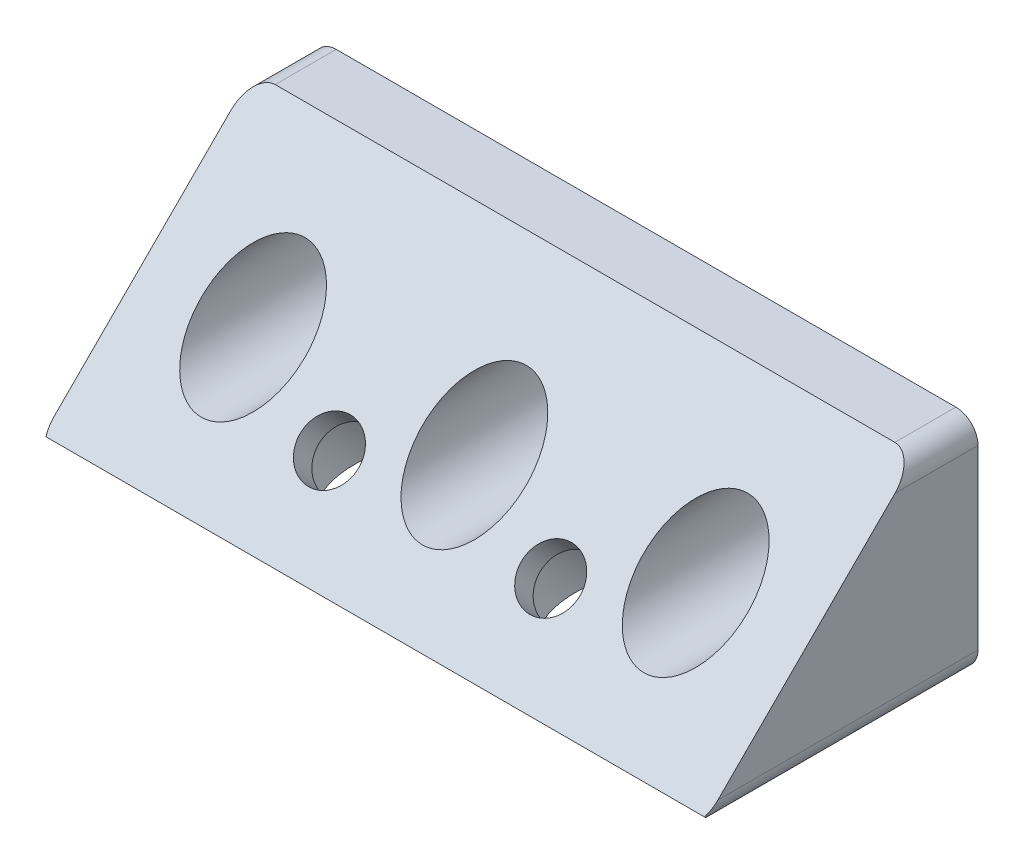
ISO-10303-21;
HEADER;
FILE_DESCRIPTION(('STEP AP214'),'2;1');
FILE_NAME('part.step','',(''),(''),'','','');
FILE_SCHEMA(('AUTOMOTIVE_DESIGN { 1 0 10303 214 1 1 1 1 }'));
ENDSEC;
DATA;
#1=APPLICATION_CONTEXT('core data for automotive mechanical design processes');
#2=APPLICATION_PROTOCOL_DEFINITION('international standard','automotive_design',2000,#1);
#3=PRODUCT_CONTEXT('',#1,'mechanical');
#4=PRODUCT('Part','Part','',(#3));
#5=PRODUCT_RELATED_PRODUCT_CATEGORY('part','',(#4));
#6=PRODUCT_DEFINITION_FORMATION('','',#4);
#7=PRODUCT_DEFINITION_CONTEXT('part definition',#1,'design');
#8=PRODUCT_DEFINITION('design','',#6,#7);
#9=PRODUCT_DEFINITION_SHAPE('','',#8);
#10=(LENGTH_UNIT() NAMED_UNIT(*) SI_UNIT(.MILLI.,.METRE.));
#11=(NAMED_UNIT(*) PLANE_ANGLE_UNIT() SI_UNIT($,.RADIAN.));
#12=(NAMED_UNIT(*) SI_UNIT($,.STERADIAN.) SOLID_ANGLE_UNIT());
#13=UNCERTAINTY_MEASURE_WITH_UNIT(LENGTH_MEASURE(1.E-05),#10,'distance_accuracy_value','');
#14=(GEOMETRIC_REPRESENTATION_CONTEXT(3) GLOBAL_UNCERTAINTY_ASSIGNED_CONTEXT((#13)) GLOBAL_UNIT_ASSIGNED_CONTEXT((#10,
#11,#12)) REPRESENTATION_CONTEXT('',''));
#15=CARTESIAN_POINT('',(0.,0.,0.));
#16=DIRECTION('',(0.,0.,1.));
#17=DIRECTION('',(1.,0.,0.));
#18=AXIS2_PLACEMENT_3D('',#15,#16,#17);
#19=CARTESIAN_POINT('',(0.,25.4,31.75));
#20=DIRECTION('',(0.,-1.,0.));
#21=DIRECTION('',(0.,0.,-1.));
#22=AXIS2_PLACEMENT_3D('',#19,#20,#21);
#23=PLANE('',#22);
#24=DIRECTION('',(-1.,0.,0.));
#25=VECTOR('',#24,1.);
#26=CARTESIAN_POINT('',(0.,25.4,0.));
#27=LINE('',#26,#25);
#28=CARTESIAN_POINT('',(73.66,25.4,0.));
#29=VERTEX_POINT('',#28);
#30=CARTESIAN_POINT('',(2.54,25.4,0.));
#31=VERTEX_POINT('',#30);
#32=EDGE_CURVE('E131',#29,#31,#27,.T.);
#33=ORIENTED_EDGE('',*,*,#32,.T.);
#34=DIRECTION('',(0.,0.,-1.));
#35=VECTOR('',#34,1.);
#36=CARTESIAN_POINT('',(2.54,25.4,31.75));
#37=LINE('',#36,#35);
#38=CARTESIAN_POINT('',(2.5400000000001,25.4,7.));
#39=VERTEX_POINT('',#38);
#40=EDGE_CURVE('E61',#31,#39,#37,.F.);
#41=ORIENTED_EDGE('',*,*,#40,.T.);
#42=DIRECTION('',(-1.,0.,0.));
#43=VECTOR('',#42,1.);
#44=CARTESIAN_POINT('',(279.411672163088,25.4,7.));
#45=LINE('',#44,#43);
#46=CARTESIAN_POINT('',(73.6600000000001,25.4,7.));
#47=VERTEX_POINT('',#46);
#48=EDGE_CURVE('E141',#47,#39,#45,.T.);
#49=ORIENTED_EDGE('',*,*,#48,.F.);
#50=DIRECTION('',(0.,0.,-1.));
#51=VECTOR('',#50,1.);
#52=CARTESIAN_POINT('',(73.66,25.4,31.75));
#53=LINE('',#52,#51);
#54=EDGE_CURVE('E152',#47,#29,#53,.T.);
#55=ORIENTED_EDGE('',*,*,#54,.T.);
#56=EDGE_LOOP('',(#33,#41,#49,#55));
#57=FACE_BOUND('',#56,.T.);
#58=ADVANCED_FACE('F45',(#57),#23,.F.);
#59=CARTESIAN_POINT('',(0.,0.,31.75));
#60=DIRECTION('',(1.,0.,0.));
#61=DIRECTION('',(0.,0.,-1.));
#62=AXIS2_PLACEMENT_3D('',#59,#60,#61);
#63=PLANE('',#62);
#64=DIRECTION('',(0.,-1.,0.));
#65=VECTOR('',#64,1.);
#66=CARTESIAN_POINT('',(0.,0.,0.));
#67=LINE('',#66,#65);
#68=CARTESIAN_POINT('',(0.,22.86,0.));
#69=VERTEX_POINT('',#68);
#70=CARTESIAN_POINT('',(0.,2.54,0.));
#71=VERTEX_POINT('',#70);
#72=EDGE_CURVE('E182',#69,#71,#67,.T.);
#73=ORIENTED_EDGE('',*,*,#72,.T.);
#74=DIRECTION('',(0.,0.,-1.));
#75=VECTOR('',#74,1.);
#76=CARTESIAN_POINT('',(0.,2.54,31.75));
#77=LINE('',#76,#75);
#78=CARTESIAN_POINT('',(0.,2.54,29.8599999999998));
#79=VERTEX_POINT('',#78);
#80=EDGE_CURVE('E218',#71,#79,#77,.F.);
#81=ORIENTED_EDGE('',*,*,#80,.T.);
#82=DIRECTION('',(0.,0.707106781186551,-0.707106781186544));
#83=VECTOR('',#82,1.);
#84=CARTESIAN_POINT('',(0.,0.324999999999861,32.0749999999999));
#85=LINE('',#84,#83);
#86=CARTESIAN_POINT('',(0.,22.86,9.53999999999998));
#87=VERTEX_POINT('',#86);
#88=EDGE_CURVE('E229',#79,#87,#85,.T.);
#89=ORIENTED_EDGE('',*,*,#88,.T.);
#90=DIRECTION('',(0.,0.,-1.));
#91=VECTOR('',#90,1.);
#92=CARTESIAN_POINT('',(0.,22.86,31.75));
#93=LINE('',#92,#91);
#94=EDGE_CURVE('E214',#87,#69,#93,.T.);
#95=ORIENTED_EDGE('',*,*,#94,.T.);
#96=EDGE_LOOP('',(#73,#81,#89,#95));
#97=FACE_BOUND('',#96,.T.);
#98=ADVANCED_FACE('F235',(#97),#63,.F.);
#99=CARTESIAN_POINT('',(0.,0.,31.75));
#100=DIRECTION('',(0.,1.,0.));
#101=DIRECTION('',(0.,0.,1.));
#102=AXIS2_PLACEMENT_3D('',#99,#100,#101);
#103=PLANE('',#102);
#104=CARTESIAN_POINT('',(50.8000000000001,0.,14.8807423414362));
#105=DIRECTION('',(0.,1.,0.));
#106=DIRECTION('',(0.,0.,-1.));
#107=AXIS2_PLACEMENT_3D('',#104,#105,#106);
#108=ELLIPSE('',#107,8.41988813911448,5.95376);
#109=CARTESIAN_POINT('',(50.8000000000001,0.,6.46085420232176));
#110=VERTEX_POINT('',#109);
#111=EDGE_CURVE('E196',#110,#110,#108,.T.);
#112=ORIENTED_EDGE('',*,*,#111,.T.);
#113=EDGE_LOOP('',(#112));
#114=FACE_BOUND('',#113,.T.);
#115=CARTESIAN_POINT('',(25.4000000000001,0.,14.8807423414362));
#116=DIRECTION('',(0.,1.,0.));
#117=DIRECTION('',(0.,0.,-1.));
#118=AXIS2_PLACEMENT_3D('',#115,#116,#117);
#119=ELLIPSE('',#118,8.41988813911448,5.95376);
#120=CARTESIAN_POINT('',(25.4000000000001,0.,6.46085420232177));
#121=VERTEX_POINT('',#120);
#122=EDGE_CURVE('E191',#121,#121,#119,.T.);
#123=ORIENTED_EDGE('',*,*,#122,.T.);
#124=EDGE_LOOP('',(#123));
#125=FACE_BOUND('',#124,.T.);
#126=DIRECTION('',(-1.,0.,0.));
#127=VECTOR('',#126,1.);
#128=CARTESIAN_POINT('',(279.411672163088,0.,29.7614846828725));
#129=LINE('',#128,#127);
#130=CARTESIAN_POINT('',(73.6600000000001,0.,29.7614846828725));
#131=VERTEX_POINT('',#130);
#132=CARTESIAN_POINT('',(2.5400000000001,0.,29.7614846828725));
#133=VERTEX_POINT('',#132);
#134=EDGE_CURVE('E123',#131,#133,#129,.T.);
#135=ORIENTED_EDGE('',*,*,#134,.T.);
#136=DIRECTION('',(0.,0.,-1.));
#137=VECTOR('',#136,1.);
#138=CARTESIAN_POINT('',(2.54,0.,31.75));
#139=LINE('',#138,#137);
#140=CARTESIAN_POINT('',(2.54,0.,0.));
#141=VERTEX_POINT('',#140);
#142=EDGE_CURVE('E130',#133,#141,#139,.T.);
#143=ORIENTED_EDGE('',*,*,#142,.T.);
#144=DIRECTION('',(1.,0.,0.));
#145=VECTOR('',#144,1.);
#146=CARTESIAN_POINT('',(0.,0.,0.));
#147=LINE('',#146,#145);
#148=CARTESIAN_POINT('',(73.66,0.,0.));
#149=VERTEX_POINT('',#148);
#150=EDGE_CURVE('E126',#141,#149,#147,.T.);
#151=ORIENTED_EDGE('',*,*,#150,.T.);
#152=DIRECTION('',(0.,0.,-1.));
#153=VECTOR('',#152,1.);
#154=CARTESIAN_POINT('',(73.66,0.,31.75));
#155=LINE('',#154,#153);
#156=EDGE_CURVE('E119',#149,#131,#155,.F.);
#157=ORIENTED_EDGE('',*,*,#156,.T.);
#158=EDGE_LOOP('',(#135,#143,#151,#157));
#159=FACE_BOUND('',#158,.T.);
#160=ADVANCED_FACE('F121',(#114,#125,#159),#103,.F.);
#161=CARTESIAN_POINT('',(76.2,0.,31.75));
#162=DIRECTION('',(-1.,0.,0.));
#163=DIRECTION('',(0.,0.,1.));
#164=AXIS2_PLACEMENT_3D('',#161,#162,#163);
#165=PLANE('',#164);
#166=DIRECTION('',(0.,1.,0.));
#167=VECTOR('',#166,1.);
#168=CARTESIAN_POINT('',(76.2,0.,0.));
#169=LINE('',#168,#167);
#170=CARTESIAN_POINT('',(76.2,2.54,0.));
#171=VERTEX_POINT('',#170);
#172=CARTESIAN_POINT('',(76.2,22.86,0.));
#173=VERTEX_POINT('',#172);
#174=EDGE_CURVE('E169',#171,#173,#169,.T.);
#175=ORIENTED_EDGE('',*,*,#174,.T.);
#176=DIRECTION('',(0.,0.,-1.));
#177=VECTOR('',#176,1.);
#178=CARTESIAN_POINT('',(76.2,22.86,31.75));
#179=LINE('',#178,#177);
#180=CARTESIAN_POINT('',(76.2,22.86,9.53999999999998));
#181=VERTEX_POINT('',#180);
#182=EDGE_CURVE('E11',#173,#181,#179,.F.);
#183=ORIENTED_EDGE('',*,*,#182,.T.);
#184=DIRECTION('',(0.,-0.707106781186551,0.707106781186544));
#185=VECTOR('',#184,1.);
#186=CARTESIAN_POINT('',(76.2,0.324999999999861,32.0749999999999));
#187=LINE('',#186,#185);
#188=CARTESIAN_POINT('',(76.2,2.54,29.8599999999998));
#189=VERTEX_POINT('',#188);
#190=EDGE_CURVE('E171',#181,#189,#187,.T.);
#191=ORIENTED_EDGE('',*,*,#190,.T.);
#192=DIRECTION('',(0.,0.,-1.));
#193=VECTOR('',#192,1.);
#194=CARTESIAN_POINT('',(76.2,2.54,31.75));
#195=LINE('',#194,#193);
#196=EDGE_CURVE('E54',#189,#171,#195,.T.);
#197=ORIENTED_EDGE('',*,*,#196,.T.);
#198=EDGE_LOOP('',(#175,#183,#191,#197));
#199=FACE_BOUND('',#198,.T.);
#200=ADVANCED_FACE('F168',(#199),#165,.F.);
#201=CARTESIAN_POINT('',(0.,0.,0.));
#202=DIRECTION('',(0.,0.,-1.));
#203=DIRECTION('',(-1.,0.,0.));
#204=AXIS2_PLACEMENT_3D('',#201,#202,#203);
#205=PLANE('',#204);
#206=CARTESIAN_POINT('',(12.7,12.7,0.));
#207=DIRECTION('',(0.,0.,-1.));
#208=DIRECTION('',(-1.,0.,0.));
#209=AXIS2_PLACEMENT_3D('',#206,#207,#208);
#210=CIRCLE('',#209,3.37819999999999);
#211=CARTESIAN_POINT('',(9.32180000000001,12.7,0.));
#212=VERTEX_POINT('',#211);
#213=EDGE_CURVE('E260',#212,#212,#210,.T.);
#214=ORIENTED_EDGE('',*,*,#213,.F.);
#215=EDGE_LOOP('',(#214));
#216=FACE_BOUND('',#215,.T.);
#217=CARTESIAN_POINT('',(38.1,12.7,0.));
#218=DIRECTION('',(0.,0.,-1.));
#219=DIRECTION('',(-1.,0.,0.));
#220=AXIS2_PLACEMENT_3D('',#217,#218,#219);
#221=CIRCLE('',#220,3.37819999999999);
#222=CARTESIAN_POINT('',(34.7218,12.7,0.));
#223=VERTEX_POINT('',#222);
#224=EDGE_CURVE('E272',#223,#223,#221,.T.);
#225=ORIENTED_EDGE('',*,*,#224,.F.);
#226=EDGE_LOOP('',(#225));
#227=FACE_BOUND('',#226,.T.);
#228=CARTESIAN_POINT('',(63.5,12.7,0.));
#229=DIRECTION('',(0.,0.,-1.));
#230=DIRECTION('',(-1.,0.,0.));
#231=AXIS2_PLACEMENT_3D('',#228,#229,#230);
#232=CIRCLE('',#231,3.3782);
#233=CARTESIAN_POINT('',(60.1218,12.7,0.));
#234=VERTEX_POINT('',#233);
#235=EDGE_CURVE('E284',#234,#234,#232,.T.);
#236=ORIENTED_EDGE('',*,*,#235,.F.);
#237=EDGE_LOOP('',(#236));
#238=FACE_BOUND('',#237,.T.);
#239=ORIENTED_EDGE('',*,*,#150,.F.);
#240=CARTESIAN_POINT('',(2.54,2.54,0.));
#241=DIRECTION('',(0.,0.,-1.));
#242=DIRECTION('',(-1.,0.,0.));
#243=AXIS2_PLACEMENT_3D('',#240,#241,#242);
#244=CIRCLE('',#243,2.54);
#245=EDGE_CURVE('E211',#141,#71,#244,.T.);
#246=ORIENTED_EDGE('',*,*,#245,.T.);
#247=ORIENTED_EDGE('',*,*,#72,.F.);
#248=CARTESIAN_POINT('',(2.54,22.86,0.));
#249=DIRECTION('',(0.,0.,-1.));
#250=DIRECTION('',(-1.,0.,0.));
#251=AXIS2_PLACEMENT_3D('',#248,#249,#250);
#252=CIRCLE('',#251,2.54);
#253=EDGE_CURVE('E208',#69,#31,#252,.T.);
#254=ORIENTED_EDGE('',*,*,#253,.T.);
#255=ORIENTED_EDGE('',*,*,#32,.F.);
#256=CARTESIAN_POINT('',(73.66,22.86,0.));
#257=DIRECTION('',(0.,0.,-1.));
#258=DIRECTION('',(-1.,0.,0.));
#259=AXIS2_PLACEMENT_3D('',#256,#257,#258);
#260=CIRCLE('',#259,2.54);
#261=EDGE_CURVE('E176',#29,#173,#260,.T.);
#262=ORIENTED_EDGE('',*,*,#261,.T.);
#263=ORIENTED_EDGE('',*,*,#174,.F.);
#264=CARTESIAN_POINT('',(73.66,2.54,0.));
#265=DIRECTION('',(0.,0.,-1.));
#266=DIRECTION('',(-1.,0.,0.));
#267=AXIS2_PLACEMENT_3D('',#264,#265,#266);
#268=CIRCLE('',#267,2.54);
#269=EDGE_CURVE('E174',#171,#149,#268,.T.);
#270=ORIENTED_EDGE('',*,*,#269,.T.);
#271=EDGE_LOOP('',(#239,#246,#247,#254,#255,#262,#263,#270));
#272=FACE_BOUND('',#271,.T.);
#273=ADVANCED_FACE('F173',(#216,#227,#238,#272),#205,.T.);
#274=CARTESIAN_POINT('',(63.5,12.7,31.75));
#275=DIRECTION('',(0.,0.,1.));
#276=DIRECTION('',(1.,0.,0.));
#277=AXIS2_PLACEMENT_3D('',#274,#275,#276);
#278=CYLINDRICAL_SURFACE('',#277,3.3782);
#279=CARTESIAN_POINT('',(63.5,12.7,2.99720000000001));
#280=DIRECTION('',(0.,0.,1.));
#281=DIRECTION('',(1.,0.,0.));
#282=AXIS2_PLACEMENT_3D('',#279,#280,#281);
#283=CIRCLE('',#282,3.3782);
#284=CARTESIAN_POINT('',(66.8782,12.7,2.99720000000001));
#285=VERTEX_POINT('',#284);
#286=EDGE_CURVE('E280',#285,#285,#283,.T.);
#287=ORIENTED_EDGE('',*,*,#286,.T.);
#288=EDGE_LOOP('',(#287));
#289=FACE_BOUND('',#288,.T.);
#290=ORIENTED_EDGE('',*,*,#235,.T.);
#291=EDGE_LOOP('',(#290));
#292=FACE_BOUND('',#291,.T.);
#293=ADVANCED_FACE('F318',(#289,#292),#278,.F.);
#294=CARTESIAN_POINT('',(66.8782,12.7,2.99720000000001));
#295=DIRECTION('',(0.,0.,-1.));
#296=DIRECTION('',(-1.,0.,0.));
#297=AXIS2_PLACEMENT_3D('',#294,#295,#296);
#298=PLANE('',#297);
#299=ORIENTED_EDGE('',*,*,#286,.F.);
#300=EDGE_LOOP('',(#299));
#301=FACE_BOUND('',#300,.T.);
#302=CARTESIAN_POINT('',(63.5,12.7,2.99720000000001));
#303=DIRECTION('',(0.,0.,1.));
#304=DIRECTION('',(1.,0.,0.));
#305=AXIS2_PLACEMENT_3D('',#302,#303,#304);
#306=CIRCLE('',#305,5.95375999999999);
#307=CARTESIAN_POINT('',(69.45376,12.7,2.99720000000001));
#308=VERTEX_POINT('',#307);
#309=EDGE_CURVE('E276',#308,#308,#306,.T.);
#310=ORIENTED_EDGE('',*,*,#309,.T.);
#311=EDGE_LOOP('',(#310));
#312=FACE_BOUND('',#311,.T.);
#313=ADVANCED_FACE('F313',(#301,#312),#298,.F.);
#314=CARTESIAN_POINT('',(63.5,12.7,31.75));
#315=DIRECTION('',(0.,0.,1.));
#316=DIRECTION('',(1.,0.,0.));
#317=AXIS2_PLACEMENT_3D('',#314,#315,#316);
#318=CYLINDRICAL_SURFACE('',#317,5.95376);
#319=CARTESIAN_POINT('',(63.5,12.7,19.6999999999999));
#320=DIRECTION('',(0.,-0.707106781186544,-0.707106781186551));
#321=DIRECTION('',(0.,-0.707106781186551,0.707106781186544));
#322=AXIS2_PLACEMENT_3D('',#319,#320,#321);
#323=ELLIPSE('',#322,8.41988813911439,5.95376);
#324=CARTESIAN_POINT('',(63.5,6.74624,25.6537599999998));
#325=VERTEX_POINT('',#324);
#326=EDGE_CURVE('E246',#325,#325,#323,.F.);
#327=ORIENTED_EDGE('',*,*,#326,.T.);
#328=EDGE_LOOP('',(#327));
#329=FACE_BOUND('',#328,.T.);
#330=ORIENTED_EDGE('',*,*,#309,.F.);
#331=EDGE_LOOP('',(#330));
#332=FACE_BOUND('',#331,.T.);
#333=ADVANCED_FACE('F309',(#329,#332),#318,.F.);
#334=CARTESIAN_POINT('',(38.1,12.7,31.75));
#335=DIRECTION('',(0.,0.,1.));
#336=DIRECTION('',(1.,0.,0.));
#337=AXIS2_PLACEMENT_3D('',#334,#335,#336);
#338=CYLINDRICAL_SURFACE('',#337,3.37819999999999);
#339=CARTESIAN_POINT('',(38.1,12.7,2.99720000000001));
#340=DIRECTION('',(0.,0.,1.));
#341=DIRECTION('',(1.,0.,0.));
#342=AXIS2_PLACEMENT_3D('',#339,#340,#341);
#343=CIRCLE('',#342,3.37819999999999);
#344=CARTESIAN_POINT('',(41.4782,12.7,2.99720000000001));
#345=VERTEX_POINT('',#344);
#346=EDGE_CURVE('E268',#345,#345,#343,.T.);
#347=ORIENTED_EDGE('',*,*,#346,.T.);
#348=EDGE_LOOP('',(#347));
#349=FACE_BOUND('',#348,.T.);
#350=ORIENTED_EDGE('',*,*,#224,.T.);
#351=EDGE_LOOP('',(#350));
#352=FACE_BOUND('',#351,.T.);
#353=ADVANCED_FACE('F312',(#349,#352),#338,.F.);
#354=CARTESIAN_POINT('',(41.4782,12.7,2.99720000000001));
#355=DIRECTION('',(0.,0.,-1.));
#356=DIRECTION('',(-1.,0.,0.));
#357=AXIS2_PLACEMENT_3D('',#354,#355,#356);
#358=PLANE('',#357);
#359=ORIENTED_EDGE('',*,*,#346,.F.);
#360=EDGE_LOOP('',(#359));
#361=FACE_BOUND('',#360,.T.);
#362=CARTESIAN_POINT('',(38.1,12.7,2.99720000000001));
#363=DIRECTION('',(0.,0.,1.));
#364=DIRECTION('',(1.,0.,0.));
#365=AXIS2_PLACEMENT_3D('',#362,#363,#364);
#366=CIRCLE('',#365,5.95376);
#367=CARTESIAN_POINT('',(44.05376,12.7,2.99720000000001));
#368=VERTEX_POINT('',#367);
#369=EDGE_CURVE('E264',#368,#368,#366,.T.);
#370=ORIENTED_EDGE('',*,*,#369,.T.);
#371=EDGE_LOOP('',(#370));
#372=FACE_BOUND('',#371,.T.);
#373=ADVANCED_FACE('F485',(#361,#372),#358,.F.);
#374=CARTESIAN_POINT('',(38.1,12.7,31.75));
#375=DIRECTION('',(0.,0.,1.));
#376=DIRECTION('',(1.,0.,0.));
#377=AXIS2_PLACEMENT_3D('',#374,#375,#376);
#378=CYLINDRICAL_SURFACE('',#377,5.95376);
#379=CARTESIAN_POINT('',(38.1,12.7,19.6999999999999));
#380=DIRECTION('',(0.,-0.707106781186544,-0.707106781186551));
#381=DIRECTION('',(0.,-0.707106781186551,0.707106781186544));
#382=AXIS2_PLACEMENT_3D('',#379,#380,#381);
#383=ELLIPSE('',#382,8.41988813911439,5.95376);
#384=CARTESIAN_POINT('',(38.1,6.74624,25.6537599999998));
#385=VERTEX_POINT('',#384);
#386=EDGE_CURVE('E190',#385,#385,#383,.F.);
#387=ORIENTED_EDGE('',*,*,#386,.T.);
#388=EDGE_LOOP('',(#387));
#389=FACE_BOUND('',#388,.T.);
#390=ORIENTED_EDGE('',*,*,#369,.F.);
#391=EDGE_LOOP('',(#390));
#392=FACE_BOUND('',#391,.T.);
#393=ADVANCED_FACE('F299',(#389,#392),#378,.F.);
#394=CARTESIAN_POINT('',(12.7,12.7,31.75));
#395=DIRECTION('',(0.,0.,1.));
#396=DIRECTION('',(1.,0.,0.));
#397=AXIS2_PLACEMENT_3D('',#394,#395,#396);
#398=CYLINDRICAL_SURFACE('',#397,3.37819999999999);
#399=CARTESIAN_POINT('',(12.7,12.7,2.99720000000001));
#400=DIRECTION('',(0.,0.,1.));
#401=DIRECTION('',(1.,0.,0.));
#402=AXIS2_PLACEMENT_3D('',#399,#400,#401);
#403=CIRCLE('',#402,3.37819999999999);
#404=CARTESIAN_POINT('',(16.0782,12.7,2.99720000000001));
#405=VERTEX_POINT('',#404);
#406=EDGE_CURVE('E256',#405,#405,#403,.T.);
#407=ORIENTED_EDGE('',*,*,#406,.T.);
#408=EDGE_LOOP('',(#407));
#409=FACE_BOUND('',#408,.T.);
#410=ORIENTED_EDGE('',*,*,#213,.T.);
#411=EDGE_LOOP('',(#410));
#412=FACE_BOUND('',#411,.T.);
#413=ADVANCED_FACE('F466',(#409,#412),#398,.F.);
#414=CARTESIAN_POINT('',(16.0782,12.7,2.99720000000001));
#415=DIRECTION('',(0.,0.,-1.));
#416=DIRECTION('',(-1.,0.,0.));
#417=AXIS2_PLACEMENT_3D('',#414,#415,#416);
#418=PLANE('',#417);
#419=ORIENTED_EDGE('',*,*,#406,.F.);
#420=EDGE_LOOP('',(#419));
#421=FACE_BOUND('',#420,.T.);
#422=CARTESIAN_POINT('',(12.7,12.7,2.99720000000001));
#423=DIRECTION('',(0.,0.,1.));
#424=DIRECTION('',(1.,0.,0.));
#425=AXIS2_PLACEMENT_3D('',#422,#423,#424);
#426=CIRCLE('',#425,5.95376);
#427=CARTESIAN_POINT('',(18.65376,12.7,2.99720000000001));
#428=VERTEX_POINT('',#427);
#429=EDGE_CURVE('E239',#428,#428,#426,.T.);
#430=ORIENTED_EDGE('',*,*,#429,.T.);
#431=EDGE_LOOP('',(#430));
#432=FACE_BOUND('',#431,.T.);
#433=ADVANCED_FACE('F455',(#421,#432),#418,.F.);
#434=CARTESIAN_POINT('',(12.7,12.7,31.75));
#435=DIRECTION('',(0.,0.,1.));
#436=DIRECTION('',(1.,0.,0.));
#437=AXIS2_PLACEMENT_3D('',#434,#435,#436);
#438=CYLINDRICAL_SURFACE('',#437,5.95376);
#439=CARTESIAN_POINT('',(12.7,12.7,19.6999999999999));
#440=DIRECTION('',(0.,-0.707106781186544,-0.707106781186551));
#441=DIRECTION('',(0.,-0.707106781186551,0.707106781186544));
#442=AXIS2_PLACEMENT_3D('',#439,#440,#441);
#443=ELLIPSE('',#442,8.41988813911439,5.95376);
#444=CARTESIAN_POINT('',(12.7,6.74624,25.6537599999998));
#445=VERTEX_POINT('',#444);
#446=EDGE_CURVE('E186',#445,#445,#443,.F.);
#447=ORIENTED_EDGE('',*,*,#446,.T.);
#448=EDGE_LOOP('',(#447));
#449=FACE_BOUND('',#448,.T.);
#450=ORIENTED_EDGE('',*,*,#429,.F.);
#451=EDGE_LOOP('',(#450));
#452=FACE_BOUND('',#451,.T.);
#453=ADVANCED_FACE('F442',(#449,#452),#438,.F.);
#454=CARTESIAN_POINT('',(279.411672163088,1.31925765856361,31.0807423414361));
#455=DIRECTION('',(0.,0.707106781186551,-0.707106781186544));
#456=DIRECTION('',(0.,0.707106781186544,0.707106781186551));
#457=AXIS2_PLACEMENT_3D('',#454,#455,#456);
#458=PLANE('',#457);
#459=DIRECTION('',(-1.,0.,0.));
#460=VECTOR('',#459,1.);
#461=CARTESIAN_POINT('',(279.411672163088,1.31925765856361,31.0807423414361));
#462=LINE('',#461,#460);
#463=CARTESIAN_POINT('',(75.8874173690229,1.31925765856361,31.0807423414361));
#464=VERTEX_POINT('',#463);
#465=CARTESIAN_POINT('',(0.312582630977332,1.31925765856361,31.0807423414361));
#466=VERTEX_POINT('',#465);
#467=EDGE_CURVE('E142',#464,#466,#462,.T.);
#468=ORIENTED_EDGE('',*,*,#467,.T.);
#469=CARTESIAN_POINT('',(2.54,2.54,32.3014846828725));
#470=DIRECTION('',(0.,0.707106781186551,-0.707106781186544));
#471=DIRECTION('',(0.,-0.707106781186544,-0.707106781186551));
#472=AXIS2_PLACEMENT_3D('',#469,#470,#471);
#473=ELLIPSE('',#472,3.59210244842768,2.54);
#474=EDGE_CURVE('E139',#466,#133,#473,.F.);
#475=ORIENTED_EDGE('',*,*,#474,.T.);
#476=ORIENTED_EDGE('',*,*,#134,.F.);
#477=CARTESIAN_POINT('',(73.66,2.54,32.3014846828725));
#478=DIRECTION('',(0.,0.707106781186551,-0.707106781186544));
#479=DIRECTION('',(0.,-0.707106781186544,-0.707106781186551));
#480=AXIS2_PLACEMENT_3D('',#477,#478,#479);
#481=ELLIPSE('',#480,3.59210244842768,2.54);
#482=EDGE_CURVE('E136',#131,#464,#481,.F.);
#483=ORIENTED_EDGE('',*,*,#482,.T.);
#484=EDGE_LOOP('',(#468,#475,#476,#483));
#485=FACE_BOUND('',#484,.T.);
#486=ADVANCED_FACE('F135',(#485),#458,.F.);
#487=CARTESIAN_POINT('',(279.411672163088,25.4,7.));
#488=DIRECTION('',(0.,-0.707106781186544,-0.707106781186551));
#489=DIRECTION('',(0.,0.707106781186551,-0.707106781186544));
#490=AXIS2_PLACEMENT_3D('',#487,#488,#489);
#491=PLANE('',#490);
#492=CARTESIAN_POINT('',(50.8000000000001,8.75962882928174,23.6403711707181));
#493=DIRECTION('',(0.,-0.707106781186544,-0.707106781186551));
#494=DIRECTION('',(0.,0.707106781186551,-0.707106781186544));
#495=AXIS2_PLACEMENT_3D('',#492,#493,#494);
#496=CIRCLE('',#495,3.37819999999999);
#497=CARTESIAN_POINT('',(50.8000000000001,11.1483769574861,21.2516230425137));
#498=VERTEX_POINT('',#497);
#499=EDGE_CURVE('E200',#498,#498,#496,.T.);
#500=ORIENTED_EDGE('',*,*,#499,.T.);
#501=EDGE_LOOP('',(#500));
#502=FACE_BOUND('',#501,.T.);
#503=CARTESIAN_POINT('',(25.4000000000001,8.75962882928174,23.6403711707181));
#504=DIRECTION('',(0.,-0.707106781186544,-0.707106781186551));
#505=DIRECTION('',(0.,0.707106781186551,-0.707106781186544));
#506=AXIS2_PLACEMENT_3D('',#503,#504,#505);
#507=CIRCLE('',#506,3.37819999999999);
#508=CARTESIAN_POINT('',(25.4000000000001,11.1483769574861,21.2516230425137));
#509=VERTEX_POINT('',#508);
#510=EDGE_CURVE('E195',#509,#509,#507,.T.);
#511=ORIENTED_EDGE('',*,*,#510,.T.);
#512=EDGE_LOOP('',(#511));
#513=FACE_BOUND('',#512,.T.);
#514=ORIENTED_EDGE('',*,*,#446,.F.);
#515=EDGE_LOOP('',(#514));
#516=FACE_BOUND('',#515,.T.);
#517=ORIENTED_EDGE('',*,*,#386,.F.);
#518=EDGE_LOOP('',(#517));
#519=FACE_BOUND('',#518,.T.);
#520=ORIENTED_EDGE('',*,*,#326,.F.);
#521=EDGE_LOOP('',(#520));
#522=FACE_BOUND('',#521,.T.);
#523=ORIENTED_EDGE('',*,*,#88,.F.);
#524=CARTESIAN_POINT('',(2.54,2.54,29.8599999999997));
#525=DIRECTION('',(0.,-0.707106781186544,-0.707106781186551));
#526=DIRECTION('',(0.,0.707106781186551,-0.707106781186544));
#527=AXIS2_PLACEMENT_3D('',#524,#525,#526);
#528=ELLIPSE('',#527,3.59210244842764,2.54);
#529=EDGE_CURVE('E148',#79,#466,#528,.F.);
#530=ORIENTED_EDGE('',*,*,#529,.T.);
#531=ORIENTED_EDGE('',*,*,#467,.F.);
#532=CARTESIAN_POINT('',(73.66,2.54,29.8599999999997));
#533=DIRECTION('',(0.,-0.707106781186544,-0.707106781186551));
#534=DIRECTION('',(0.,0.707106781186551,-0.707106781186544));
#535=AXIS2_PLACEMENT_3D('',#532,#533,#534);
#536=ELLIPSE('',#535,3.59210244842764,2.54);
#537=EDGE_CURVE('E146',#464,#189,#536,.F.);
#538=ORIENTED_EDGE('',*,*,#537,.T.);
#539=ORIENTED_EDGE('',*,*,#190,.F.);
#540=CARTESIAN_POINT('',(73.66,22.86,9.53999999999997));
#541=DIRECTION('',(0.,-0.707106781186544,-0.707106781186551));
#542=DIRECTION('',(0.,0.707106781186551,-0.707106781186544));
#543=AXIS2_PLACEMENT_3D('',#540,#541,#542);
#544=ELLIPSE('',#543,3.59210244842764,2.54);
#545=EDGE_CURVE('E68',#181,#47,#544,.F.);
#546=ORIENTED_EDGE('',*,*,#545,.T.);
#547=ORIENTED_EDGE('',*,*,#48,.T.);
#548=CARTESIAN_POINT('',(2.54,22.86,9.53999999999997));
#549=DIRECTION('',(0.,-0.707106781186544,-0.707106781186551));
#550=DIRECTION('',(0.,0.707106781186551,-0.707106781186544));
#551=AXIS2_PLACEMENT_3D('',#548,#549,#550);
#552=ELLIPSE('',#551,3.59210244842764,2.54);
#553=EDGE_CURVE('E154',#39,#87,#552,.F.);
#554=ORIENTED_EDGE('',*,*,#553,.T.);
#555=EDGE_LOOP('',(#523,#530,#531,#538,#539,#546,#547,#554));
#556=FACE_BOUND('',#555,.T.);
#557=ADVANCED_FACE('F228',(#502,#513,#516,#519,#522,#556),#491,.F.);
#558=CARTESIAN_POINT('',(25.4000000000001,-9.20088341285647,5.67985892857967));
#559=DIRECTION('',(0.,-0.707106781186544,-0.707106781186551));
#560=DIRECTION('',(0.,0.707106781186551,-0.707106781186544));
#561=AXIS2_PLACEMENT_3D('',#558,#559,#560);
#562=CYLINDRICAL_SURFACE('',#561,5.95376);
#563=CARTESIAN_POINT('',(25.4000000000001,6.64028838470943,21.5210307261457));
#564=DIRECTION('',(0.,-0.707106781186544,-0.707106781186551));
#565=DIRECTION('',(0.,0.707106781186551,-0.707106781186544));
#566=AXIS2_PLACEMENT_3D('',#563,#564,#565);
#567=CIRCLE('',#566,5.95376);
#568=CARTESIAN_POINT('',(25.4000000000001,10.8502324542667,17.3110866565886));
#569=VERTEX_POINT('',#568);
#570=EDGE_CURVE('E199',#569,#569,#567,.T.);
#571=ORIENTED_EDGE('',*,*,#570,.F.);
#572=EDGE_LOOP('',(#571));
#573=FACE_BOUND('',#572,.T.);
#574=ORIENTED_EDGE('',*,*,#122,.F.);
#575=EDGE_LOOP('',(#574));
#576=FACE_BOUND('',#575,.T.);
#577=ADVANCED_FACE('F304',(#573,#576),#562,.F.);
#578=CARTESIAN_POINT('',(25.4000000000001,-9.20088341285647,5.67985892857967));
#579=DIRECTION('',(0.,-0.707106781186544,-0.707106781186551));
#580=DIRECTION('',(0.,0.707106781186551,-0.707106781186544));
#581=AXIS2_PLACEMENT_3D('',#578,#579,#580);
#582=CYLINDRICAL_SURFACE('',#581,3.37819999999999);
#583=ORIENTED_EDGE('',*,*,#510,.F.);
#584=EDGE_LOOP('',(#583));
#585=FACE_BOUND('',#584,.T.);
#586=CARTESIAN_POINT('',(25.4000000000001,6.64028838470943,21.5210307261457));
#587=DIRECTION('',(0.,-0.707106781186544,-0.707106781186551));
#588=DIRECTION('',(0.,0.707106781186551,-0.707106781186544));
#589=AXIS2_PLACEMENT_3D('',#586,#587,#588);
#590=CIRCLE('',#589,3.37819999999999);
#591=CARTESIAN_POINT('',(25.4000000000001,9.02903651291383,19.1322825979414));
#592=VERTEX_POINT('',#591);
#593=EDGE_CURVE('E569',#592,#592,#590,.T.);
#594=ORIENTED_EDGE('',*,*,#593,.T.);
#595=EDGE_LOOP('',(#594));
#596=FACE_BOUND('',#595,.T.);
#597=ADVANCED_FACE('F407',(#585,#596),#582,.F.);
#598=CARTESIAN_POINT('',(28.7782000000001,6.64028838470943,21.5210307261457));
#599=DIRECTION('',(0.,0.707106781186544,0.707106781186551));
#600=DIRECTION('',(0.,-0.707106781186551,0.707106781186544));
#601=AXIS2_PLACEMENT_3D('',#598,#599,#600);
#602=PLANE('',#601);
#603=ORIENTED_EDGE('',*,*,#593,.F.);
#604=EDGE_LOOP('',(#603));
#605=FACE_BOUND('',#604,.T.);
#606=ORIENTED_EDGE('',*,*,#570,.T.);
#607=EDGE_LOOP('',(#606));
#608=FACE_BOUND('',#607,.T.);
#609=ADVANCED_FACE('F397',(#605,#608),#602,.F.);
#610=CARTESIAN_POINT('',(50.8000000000001,-9.20088341285647,5.67985892857967));
#611=DIRECTION('',(0.,-0.707106781186544,-0.707106781186551));
#612=DIRECTION('',(0.,0.707106781186551,-0.707106781186544));
#613=AXIS2_PLACEMENT_3D('',#610,#611,#612);
#614=CYLINDRICAL_SURFACE('',#613,5.95376);
#615=CARTESIAN_POINT('',(50.8000000000001,6.64028838470943,21.5210307261457));
#616=DIRECTION('',(0.,-0.707106781186544,-0.707106781186551));
#617=DIRECTION('',(0.,0.707106781186551,-0.707106781186544));
#618=AXIS2_PLACEMENT_3D('',#615,#616,#617);
#619=CIRCLE('',#618,5.95376);
#620=CARTESIAN_POINT('',(50.8000000000001,10.8502324542667,17.3110866565886));
#621=VERTEX_POINT('',#620);
#622=EDGE_CURVE('E588',#621,#621,#619,.T.);
#623=ORIENTED_EDGE('',*,*,#622,.F.);
#624=EDGE_LOOP('',(#623));
#625=FACE_BOUND('',#624,.T.);
#626=ORIENTED_EDGE('',*,*,#111,.F.);
#627=EDGE_LOOP('',(#626));
#628=FACE_BOUND('',#627,.T.);
#629=ADVANCED_FACE('F387',(#625,#628),#614,.F.);
#630=CARTESIAN_POINT('',(50.8000000000001,-9.20088341285647,5.67985892857967));
#631=DIRECTION('',(0.,-0.707106781186544,-0.707106781186551));
#632=DIRECTION('',(0.,0.707106781186551,-0.707106781186544));
#633=AXIS2_PLACEMENT_3D('',#630,#631,#632);
#634=CYLINDRICAL_SURFACE('',#633,3.37819999999999);
#635=ORIENTED_EDGE('',*,*,#499,.F.);
#636=EDGE_LOOP('',(#635));
#637=FACE_BOUND('',#636,.T.);
#638=CARTESIAN_POINT('',(50.8000000000001,6.64028838470943,21.5210307261457));
#639=DIRECTION('',(0.,-0.707106781186544,-0.707106781186551));
#640=DIRECTION('',(0.,0.707106781186551,-0.707106781186544));
#641=AXIS2_PLACEMENT_3D('',#638,#639,#640);
#642=CIRCLE('',#641,3.3782);
#643=CARTESIAN_POINT('',(50.8000000000001,9.02903651291383,19.1322825979414));
#644=VERTEX_POINT('',#643);
#645=EDGE_CURVE('E584',#644,#644,#642,.T.);
#646=ORIENTED_EDGE('',*,*,#645,.T.);
#647=EDGE_LOOP('',(#646));
#648=FACE_BOUND('',#647,.T.);
#649=ADVANCED_FACE('F377',(#637,#648),#634,.F.);
#650=CARTESIAN_POINT('',(54.1782000000001,6.64028838470943,21.5210307261457));
#651=DIRECTION('',(0.,0.707106781186544,0.707106781186551));
#652=DIRECTION('',(0.,-0.707106781186551,0.707106781186544));
#653=AXIS2_PLACEMENT_3D('',#650,#651,#652);
#654=PLANE('',#653);
#655=ORIENTED_EDGE('',*,*,#645,.F.);
#656=EDGE_LOOP('',(#655));
#657=FACE_BOUND('',#656,.T.);
#658=ORIENTED_EDGE('',*,*,#622,.T.);
#659=EDGE_LOOP('',(#658));
#660=FACE_BOUND('',#659,.T.);
#661=ADVANCED_FACE('F344',(#657,#660),#654,.F.);
#662=CARTESIAN_POINT('',(2.54,2.54,31.75));
#663=DIRECTION('',(0.,0.,-1.));
#664=DIRECTION('',(-1.,0.,0.));
#665=AXIS2_PLACEMENT_3D('',#662,#663,#664);
#666=CYLINDRICAL_SURFACE('',#665,2.54);
#667=ORIENTED_EDGE('',*,*,#529,.F.);
#668=ORIENTED_EDGE('',*,*,#80,.F.);
#669=ORIENTED_EDGE('',*,*,#245,.F.);
#670=ORIENTED_EDGE('',*,*,#142,.F.);
#671=ORIENTED_EDGE('',*,*,#474,.F.);
#672=EDGE_LOOP('',(#667,#668,#669,#670,#671));
#673=FACE_BOUND('',#672,.T.);
#674=ADVANCED_FACE('F289',(#673),#666,.T.);
#675=CARTESIAN_POINT('',(2.54,22.86,31.75));
#676=DIRECTION('',(0.,0.,-1.));
#677=DIRECTION('',(-1.,0.,0.));
#678=AXIS2_PLACEMENT_3D('',#675,#676,#677);
#679=CYLINDRICAL_SURFACE('',#678,2.54);
#680=ORIENTED_EDGE('',*,*,#553,.F.);
#681=ORIENTED_EDGE('',*,*,#40,.F.);
#682=ORIENTED_EDGE('',*,*,#253,.F.);
#683=ORIENTED_EDGE('',*,*,#94,.F.);
#684=EDGE_LOOP('',(#680,#681,#682,#683));
#685=FACE_BOUND('',#684,.T.);
#686=ADVANCED_FACE('F241',(#685),#679,.T.);
#687=CARTESIAN_POINT('',(73.66,22.86,31.75));
#688=DIRECTION('',(0.,0.,-1.));
#689=DIRECTION('',(-1.,0.,0.));
#690=AXIS2_PLACEMENT_3D('',#687,#688,#689);
#691=CYLINDRICAL_SURFACE('',#690,2.54);
#692=ORIENTED_EDGE('',*,*,#545,.F.);
#693=ORIENTED_EDGE('',*,*,#182,.F.);
#694=ORIENTED_EDGE('',*,*,#261,.F.);
#695=ORIENTED_EDGE('',*,*,#54,.F.);
#696=EDGE_LOOP('',(#692,#693,#694,#695));
#697=FACE_BOUND('',#696,.T.);
#698=ADVANCED_FACE('F244',(#697),#691,.T.);
#699=CARTESIAN_POINT('',(73.66,2.54,31.75));
#700=DIRECTION('',(0.,0.,-1.));
#701=DIRECTION('',(-1.,0.,0.));
#702=AXIS2_PLACEMENT_3D('',#699,#700,#701);
#703=CYLINDRICAL_SURFACE('',#702,2.54);
#704=ORIENTED_EDGE('',*,*,#482,.F.);
#705=ORIENTED_EDGE('',*,*,#156,.F.);
#706=ORIENTED_EDGE('',*,*,#269,.F.);
#707=ORIENTED_EDGE('',*,*,#196,.F.);
#708=ORIENTED_EDGE('',*,*,#537,.F.);
#709=EDGE_LOOP('',(#704,#705,#706,#707,#708));
#710=FACE_BOUND('',#709,.T.);
#711=ADVANCED_FACE('F47',(#710),#703,.T.);
#712=CLOSED_SHELL('',(#58,#98,#160,#200,#273,#293,#313,#333,#353,#373,#393,#413,#433,#453,#486,
#557,#577,#597,#609,#629,#649,#661,#674,#686,#698,#711));
#713=MANIFOLD_SOLID_BREP('B2',#712);
#714=ADVANCED_BREP_SHAPE_REPRESENTATION('',(#18,#713),#14);
#715=SHAPE_DEFINITION_REPRESENTATION(#9,#714);
ENDSEC;
END-ISO-10303-21;
